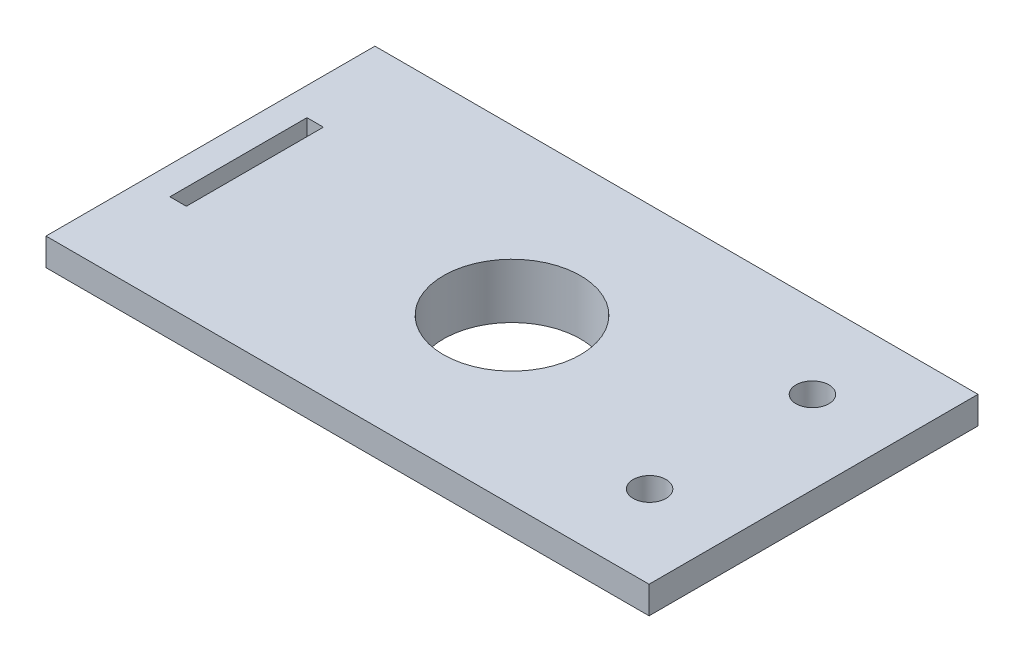
ISO-10303-21;
HEADER;
FILE_DESCRIPTION(('STEP AP214'),'2;1');
FILE_NAME('part.step','',(''),(''),'','','');
FILE_SCHEMA(('AUTOMOTIVE_DESIGN { 1 0 10303 214 1 1 1 1 }'));
ENDSEC;
DATA;
#1=APPLICATION_CONTEXT('core data for automotive mechanical design processes');
#2=APPLICATION_PROTOCOL_DEFINITION('international standard','automotive_design',2000,#1);
#3=PRODUCT_CONTEXT('',#1,'mechanical');
#4=PRODUCT('Part','Part','',(#3));
#5=PRODUCT_RELATED_PRODUCT_CATEGORY('part','',(#4));
#6=PRODUCT_DEFINITION_FORMATION('','',#4);
#7=PRODUCT_DEFINITION_CONTEXT('part definition',#1,'design');
#8=PRODUCT_DEFINITION('design','',#6,#7);
#9=PRODUCT_DEFINITION_SHAPE('','',#8);
#10=(LENGTH_UNIT() NAMED_UNIT(*) SI_UNIT(.MILLI.,.METRE.));
#11=(NAMED_UNIT(*) PLANE_ANGLE_UNIT() SI_UNIT($,.RADIAN.));
#12=(NAMED_UNIT(*) SI_UNIT($,.STERADIAN.) SOLID_ANGLE_UNIT());
#13=UNCERTAINTY_MEASURE_WITH_UNIT(LENGTH_MEASURE(1.E-05),#10,'distance_accuracy_value','');
#14=(GEOMETRIC_REPRESENTATION_CONTEXT(3) GLOBAL_UNCERTAINTY_ASSIGNED_CONTEXT((#13)) GLOBAL_UNIT_ASSIGNED_CONTEXT((#10,
#11,#12)) REPRESENTATION_CONTEXT('',''));
#15=CARTESIAN_POINT('',(0.,0.,0.));
#16=DIRECTION('',(0.,0.,1.));
#17=DIRECTION('',(1.,0.,0.));
#18=AXIS2_PLACEMENT_3D('',#15,#16,#17);
#19=CARTESIAN_POINT('',(-49.9,-5.,-24.9));
#20=DIRECTION('',(1.,0.,0.));
#21=DIRECTION('',(0.,0.,-1.));
#22=AXIS2_PLACEMENT_3D('',#19,#20,#21);
#23=PLANE('',#22);
#24=DIRECTION('',(0.,0.,-1.));
#25=VECTOR('',#24,1.);
#26=CARTESIAN_POINT('',(-49.9,-5.,-24.9));
#27=LINE('',#26,#25);
#28=CARTESIAN_POINT('',(-49.9,-5.,-12.5));
#29=VERTEX_POINT('',#28);
#30=CARTESIAN_POINT('',(-49.9,-5.,-24.9));
#31=VERTEX_POINT('',#30);
#32=EDGE_CURVE('E179',#29,#31,#27,.T.);
#33=ORIENTED_EDGE('',*,*,#32,.F.);
#34=DIRECTION('',(0.,-1.,0.));
#35=VECTOR('',#34,1.);
#36=CARTESIAN_POINT('',(-49.9,5.,-12.5));
#37=LINE('',#36,#35);
#38=CARTESIAN_POINT('',(-49.9,0.,-12.5));
#39=VERTEX_POINT('',#38);
#40=EDGE_CURVE('E165',#39,#29,#37,.T.);
#41=ORIENTED_EDGE('',*,*,#40,.F.);
#42=DIRECTION('',(0.,0.,-1.));
#43=VECTOR('',#42,1.);
#44=CARTESIAN_POINT('',(-49.9,0.,-24.9));
#45=LINE('',#44,#43);
#46=CARTESIAN_POINT('',(-49.9,0.,-24.9));
#47=VERTEX_POINT('',#46);
#48=EDGE_CURVE('E191',#39,#47,#45,.T.);
#49=ORIENTED_EDGE('',*,*,#48,.T.);
#50=DIRECTION('',(0.,1.,0.));
#51=VECTOR('',#50,1.);
#52=CARTESIAN_POINT('',(-49.9,-5.,-24.9));
#53=LINE('',#52,#51);
#54=EDGE_CURVE('E199',#31,#47,#53,.T.);
#55=ORIENTED_EDGE('',*,*,#54,.F.);
#56=EDGE_LOOP('',(#33,#41,#49,#55));
#57=FACE_BOUND('',#56,.T.);
#58=ADVANCED_FACE('F35',(#57),#23,.F.);
#59=CARTESIAN_POINT('',(55.,5.,30.));
#60=DIRECTION('',(-1.,0.,0.));
#61=DIRECTION('',(0.,0.,1.));
#62=AXIS2_PLACEMENT_3D('',#59,#60,#61);
#63=PLANE('',#62);
#64=DIRECTION('',(0.,0.,-1.));
#65=VECTOR('',#64,1.);
#66=CARTESIAN_POINT('',(55.,0.,30.));
#67=LINE('',#66,#65);
#68=CARTESIAN_POINT('',(55.,0.,30.));
#69=VERTEX_POINT('',#68);
#70=CARTESIAN_POINT('',(55.,0.,-30.));
#71=VERTEX_POINT('',#70);
#72=EDGE_CURVE('E208',#69,#71,#67,.T.);
#73=ORIENTED_EDGE('',*,*,#72,.T.);
#74=DIRECTION('',(0.,-1.,0.));
#75=VECTOR('',#74,1.);
#76=CARTESIAN_POINT('',(55.,5.,-30.));
#77=LINE('',#76,#75);
#78=CARTESIAN_POINT('',(55.,5.,-30.));
#79=VERTEX_POINT('',#78);
#80=EDGE_CURVE('E11',#79,#71,#77,.T.);
#81=ORIENTED_EDGE('',*,*,#80,.F.);
#82=DIRECTION('',(0.,0.,-1.));
#83=VECTOR('',#82,1.);
#84=CARTESIAN_POINT('',(55.,5.,30.));
#85=LINE('',#84,#83);
#86=CARTESIAN_POINT('',(55.,5.,30.));
#87=VERTEX_POINT('',#86);
#88=EDGE_CURVE('E209',#87,#79,#85,.T.);
#89=ORIENTED_EDGE('',*,*,#88,.F.);
#90=DIRECTION('',(0.,-1.,0.));
#91=VECTOR('',#90,1.);
#92=CARTESIAN_POINT('',(55.,5.,30.));
#93=LINE('',#92,#91);
#94=EDGE_CURVE('E219',#87,#69,#93,.T.);
#95=ORIENTED_EDGE('',*,*,#94,.T.);
#96=EDGE_LOOP('',(#73,#81,#89,#95));
#97=FACE_BOUND('',#96,.T.);
#98=ADVANCED_FACE('F37',(#97),#63,.F.);
#99=CARTESIAN_POINT('',(-55.,5.,-30.));
#100=DIRECTION('',(0.,0.,1.));
#101=DIRECTION('',(1.,0.,0.));
#102=AXIS2_PLACEMENT_3D('',#99,#100,#101);
#103=PLANE('',#102);
#104=DIRECTION('',(-1.,0.,0.));
#105=VECTOR('',#104,1.);
#106=CARTESIAN_POINT('',(-55.,0.,-30.));
#107=LINE('',#106,#105);
#108=CARTESIAN_POINT('',(-55.,0.,-30.));
#109=VERTEX_POINT('',#108);
#110=EDGE_CURVE('E222',#71,#109,#107,.T.);
#111=ORIENTED_EDGE('',*,*,#110,.T.);
#112=DIRECTION('',(0.,-1.,0.));
#113=VECTOR('',#112,1.);
#114=CARTESIAN_POINT('',(-55.,5.,-30.));
#115=LINE('',#114,#113);
#116=CARTESIAN_POINT('',(-55.,5.,-30.));
#117=VERTEX_POINT('',#116);
#118=EDGE_CURVE('E43',#117,#109,#115,.T.);
#119=ORIENTED_EDGE('',*,*,#118,.F.);
#120=DIRECTION('',(-1.,0.,0.));
#121=VECTOR('',#120,1.);
#122=CARTESIAN_POINT('',(-55.,5.,-30.));
#123=LINE('',#122,#121);
#124=EDGE_CURVE('E212',#79,#117,#123,.T.);
#125=ORIENTED_EDGE('',*,*,#124,.F.);
#126=ORIENTED_EDGE('',*,*,#80,.T.);
#127=EDGE_LOOP('',(#111,#119,#125,#126));
#128=FACE_BOUND('',#127,.T.);
#129=ADVANCED_FACE('F250',(#128),#103,.F.);
#130=CARTESIAN_POINT('',(-55.,5.,30.));
#131=DIRECTION('',(1.,0.,0.));
#132=DIRECTION('',(0.,0.,-1.));
#133=AXIS2_PLACEMENT_3D('',#130,#131,#132);
#134=PLANE('',#133);
#135=DIRECTION('',(0.,0.,1.));
#136=VECTOR('',#135,1.);
#137=CARTESIAN_POINT('',(-55.,0.,30.));
#138=LINE('',#137,#136);
#139=CARTESIAN_POINT('',(-55.,0.,30.));
#140=VERTEX_POINT('',#139);
#141=EDGE_CURVE('E224',#109,#140,#138,.T.);
#142=ORIENTED_EDGE('',*,*,#141,.T.);
#143=DIRECTION('',(0.,-1.,0.));
#144=VECTOR('',#143,1.);
#145=CARTESIAN_POINT('',(-55.,5.,30.));
#146=LINE('',#145,#144);
#147=CARTESIAN_POINT('',(-55.,5.,30.));
#148=VERTEX_POINT('',#147);
#149=EDGE_CURVE('E229',#148,#140,#146,.T.);
#150=ORIENTED_EDGE('',*,*,#149,.F.);
#151=DIRECTION('',(0.,0.,1.));
#152=VECTOR('',#151,1.);
#153=CARTESIAN_POINT('',(-55.,5.,30.));
#154=LINE('',#153,#152);
#155=EDGE_CURVE('E215',#117,#148,#154,.T.);
#156=ORIENTED_EDGE('',*,*,#155,.F.);
#157=ORIENTED_EDGE('',*,*,#118,.T.);
#158=EDGE_LOOP('',(#142,#150,#156,#157));
#159=FACE_BOUND('',#158,.T.);
#160=ADVANCED_FACE('F236',(#159),#134,.F.);
#161=CARTESIAN_POINT('',(-55.,5.,30.));
#162=DIRECTION('',(0.,0.,-1.));
#163=DIRECTION('',(-1.,0.,0.));
#164=AXIS2_PLACEMENT_3D('',#161,#162,#163);
#165=PLANE('',#164);
#166=DIRECTION('',(1.,0.,0.));
#167=VECTOR('',#166,1.);
#168=CARTESIAN_POINT('',(-55.,0.,30.));
#169=LINE('',#168,#167);
#170=EDGE_CURVE('E213',#140,#69,#169,.T.);
#171=ORIENTED_EDGE('',*,*,#170,.T.);
#172=ORIENTED_EDGE('',*,*,#94,.F.);
#173=DIRECTION('',(1.,0.,0.));
#174=VECTOR('',#173,1.);
#175=CARTESIAN_POINT('',(-55.,5.,30.));
#176=LINE('',#175,#174);
#177=EDGE_CURVE('E217',#148,#87,#176,.T.);
#178=ORIENTED_EDGE('',*,*,#177,.F.);
#179=ORIENTED_EDGE('',*,*,#149,.T.);
#180=EDGE_LOOP('',(#171,#172,#178,#179));
#181=FACE_BOUND('',#180,.T.);
#182=ADVANCED_FACE('F245',(#181),#165,.F.);
#183=CARTESIAN_POINT('',(0.,5.,0.));
#184=DIRECTION('',(0.,-1.,0.));
#185=DIRECTION('',(0.,0.,-1.));
#186=AXIS2_PLACEMENT_3D('',#183,#184,#185);
#187=PLANE('',#186);
#188=CARTESIAN_POINT('',(0.,5.,0.));
#189=DIRECTION('',(0.,1.,0.));
#190=DIRECTION('',(0.,0.,1.));
#191=AXIS2_PLACEMENT_3D('',#188,#189,#190);
#192=CIRCLE('',#191,12.5);
#193=CARTESIAN_POINT('',(0.,5.,12.5));
#194=VERTEX_POINT('',#193);
#195=EDGE_CURVE('E328',#194,#194,#192,.T.);
#196=ORIENTED_EDGE('',*,*,#195,.F.);
#197=EDGE_LOOP('',(#196));
#198=FACE_BOUND('',#197,.T.);
#199=CARTESIAN_POINT('',(39.9,5.,-14.9));
#200=DIRECTION('',(0.,-1.,0.));
#201=DIRECTION('',(0.,0.,-1.));
#202=AXIS2_PLACEMENT_3D('',#199,#200,#201);
#203=CIRCLE('',#202,3.);
#204=CARTESIAN_POINT('',(39.9,5.,-17.9));
#205=VERTEX_POINT('',#204);
#206=EDGE_CURVE('E160',#205,#205,#203,.T.);
#207=ORIENTED_EDGE('',*,*,#206,.T.);
#208=EDGE_LOOP('',(#207));
#209=FACE_BOUND('',#208,.T.);
#210=CARTESIAN_POINT('',(40.,5.,14.9));
#211=DIRECTION('',(0.,-1.,0.));
#212=DIRECTION('',(0.,0.,-1.));
#213=AXIS2_PLACEMENT_3D('',#210,#211,#212);
#214=CIRCLE('',#213,3.);
#215=CARTESIAN_POINT('',(40.,5.,11.9));
#216=VERTEX_POINT('',#215);
#217=EDGE_CURVE('E326',#216,#216,#214,.T.);
#218=ORIENTED_EDGE('',*,*,#217,.T.);
#219=EDGE_LOOP('',(#218));
#220=FACE_BOUND('',#219,.T.);
#221=DIRECTION('',(0.,0.,-1.));
#222=VECTOR('',#221,1.);
#223=CARTESIAN_POINT('',(-49.9,5.,-12.5));
#224=LINE('',#223,#222);
#225=CARTESIAN_POINT('',(-49.9,5.,12.5));
#226=VERTEX_POINT('',#225);
#227=CARTESIAN_POINT('',(-49.9,5.,-12.5));
#228=VERTEX_POINT('',#227);
#229=EDGE_CURVE('E139',#226,#228,#224,.T.);
#230=ORIENTED_EDGE('',*,*,#229,.T.);
#231=DIRECTION('',(1.,0.,0.));
#232=VECTOR('',#231,1.);
#233=CARTESIAN_POINT('',(-49.9,5.,-12.5));
#234=LINE('',#233,#232);
#235=CARTESIAN_POINT('',(-46.9,5.,-12.5));
#236=VERTEX_POINT('',#235);
#237=EDGE_CURVE('E133',#228,#236,#234,.T.);
#238=ORIENTED_EDGE('',*,*,#237,.T.);
#239=DIRECTION('',(0.,0.,1.));
#240=VECTOR('',#239,1.);
#241=CARTESIAN_POINT('',(-46.9,5.,-12.5));
#242=LINE('',#241,#240);
#243=CARTESIAN_POINT('',(-46.9,5.,12.5));
#244=VERTEX_POINT('',#243);
#245=EDGE_CURVE('E142',#236,#244,#242,.T.);
#246=ORIENTED_EDGE('',*,*,#245,.T.);
#247=DIRECTION('',(-1.,0.,0.));
#248=VECTOR('',#247,1.);
#249=CARTESIAN_POINT('',(-46.9,5.,12.5));
#250=LINE('',#249,#248);
#251=EDGE_CURVE('E50',#244,#226,#250,.T.);
#252=ORIENTED_EDGE('',*,*,#251,.T.);
#253=EDGE_LOOP('',(#230,#238,#246,#252));
#254=FACE_BOUND('',#253,.T.);
#255=ORIENTED_EDGE('',*,*,#88,.T.);
#256=ORIENTED_EDGE('',*,*,#124,.T.);
#257=ORIENTED_EDGE('',*,*,#155,.T.);
#258=ORIENTED_EDGE('',*,*,#177,.T.);
#259=EDGE_LOOP('',(#255,#256,#257,#258));
#260=FACE_BOUND('',#259,.T.);
#261=ADVANCED_FACE('F146',(#198,#209,#220,#254,#260),#187,.F.);
#262=CARTESIAN_POINT('',(0.,0.,0.));
#263=DIRECTION('',(0.,-1.,0.));
#264=DIRECTION('',(0.,0.,-1.));
#265=AXIS2_PLACEMENT_3D('',#262,#263,#264);
#266=PLANE('',#265);
#267=DIRECTION('',(0.,0.,1.));
#268=VECTOR('',#267,1.);
#269=CARTESIAN_POINT('',(49.9,0.,-24.9));
#270=LINE('',#269,#268);
#271=CARTESIAN_POINT('',(49.9,0.,-24.9));
#272=VERTEX_POINT('',#271);
#273=CARTESIAN_POINT('',(49.9,0.,24.9));
#274=VERTEX_POINT('',#273);
#275=EDGE_CURVE('E172',#272,#274,#270,.T.);
#276=ORIENTED_EDGE('',*,*,#275,.F.);
#277=DIRECTION('',(1.,0.,0.));
#278=VECTOR('',#277,1.);
#279=CARTESIAN_POINT('',(-49.9,0.,-24.9));
#280=LINE('',#279,#278);
#281=EDGE_CURVE('E177',#47,#272,#280,.T.);
#282=ORIENTED_EDGE('',*,*,#281,.F.);
#283=ORIENTED_EDGE('',*,*,#48,.F.);
#284=DIRECTION('',(0.,0.,-1.));
#285=VECTOR('',#284,1.);
#286=CARTESIAN_POINT('',(-49.9,0.,0.));
#287=LINE('',#286,#285);
#288=CARTESIAN_POINT('',(-49.9,0.,12.5));
#289=VERTEX_POINT('',#288);
#290=EDGE_CURVE('E164',#289,#39,#287,.T.);
#291=ORIENTED_EDGE('',*,*,#290,.F.);
#292=CARTESIAN_POINT('',(-49.9,0.,24.9));
#293=VERTEX_POINT('',#292);
#294=EDGE_CURVE('E192',#293,#289,#45,.T.);
#295=ORIENTED_EDGE('',*,*,#294,.F.);
#296=DIRECTION('',(-1.,0.,0.));
#297=VECTOR('',#296,1.);
#298=CARTESIAN_POINT('',(-49.9,0.,24.9));
#299=LINE('',#298,#297);
#300=EDGE_CURVE('E188',#274,#293,#299,.T.);
#301=ORIENTED_EDGE('',*,*,#300,.F.);
#302=EDGE_LOOP('',(#276,#282,#283,#291,#295,#301));
#303=FACE_BOUND('',#302,.T.);
#304=ORIENTED_EDGE('',*,*,#72,.F.);
#305=ORIENTED_EDGE('',*,*,#170,.F.);
#306=ORIENTED_EDGE('',*,*,#141,.F.);
#307=ORIENTED_EDGE('',*,*,#110,.F.);
#308=EDGE_LOOP('',(#304,#305,#306,#307));
#309=FACE_BOUND('',#308,.T.);
#310=ADVANCED_FACE('F242',(#303,#309),#266,.T.);
#311=CARTESIAN_POINT('',(49.9,-5.,-24.9));
#312=DIRECTION('',(-1.,0.,0.));
#313=DIRECTION('',(0.,0.,1.));
#314=AXIS2_PLACEMENT_3D('',#311,#312,#313);
#315=PLANE('',#314);
#316=ORIENTED_EDGE('',*,*,#275,.T.);
#317=DIRECTION('',(0.,1.,0.));
#318=VECTOR('',#317,1.);
#319=CARTESIAN_POINT('',(49.9,-5.,24.9));
#320=LINE('',#319,#318);
#321=CARTESIAN_POINT('',(49.9,-5.,24.9));
#322=VERTEX_POINT('',#321);
#323=EDGE_CURVE('E205',#322,#274,#320,.T.);
#324=ORIENTED_EDGE('',*,*,#323,.F.);
#325=DIRECTION('',(0.,0.,1.));
#326=VECTOR('',#325,1.);
#327=CARTESIAN_POINT('',(49.9,-5.,-24.9));
#328=LINE('',#327,#326);
#329=CARTESIAN_POINT('',(49.9,-5.,-24.9));
#330=VERTEX_POINT('',#329);
#331=EDGE_CURVE('E173',#330,#322,#328,.T.);
#332=ORIENTED_EDGE('',*,*,#331,.F.);
#333=DIRECTION('',(0.,1.,0.));
#334=VECTOR('',#333,1.);
#335=CARTESIAN_POINT('',(49.9,-5.,-24.9));
#336=LINE('',#335,#334);
#337=EDGE_CURVE('E185',#330,#272,#336,.T.);
#338=ORIENTED_EDGE('',*,*,#337,.T.);
#339=EDGE_LOOP('',(#316,#324,#332,#338));
#340=FACE_BOUND('',#339,.T.);
#341=ADVANCED_FACE('F276',(#340),#315,.F.);
#342=CARTESIAN_POINT('',(-49.9,-5.,24.9));
#343=DIRECTION('',(0.,0.,-1.));
#344=DIRECTION('',(-1.,0.,0.));
#345=AXIS2_PLACEMENT_3D('',#342,#343,#344);
#346=PLANE('',#345);
#347=ORIENTED_EDGE('',*,*,#300,.T.);
#348=DIRECTION('',(0.,1.,0.));
#349=VECTOR('',#348,1.);
#350=CARTESIAN_POINT('',(-49.9,-5.,24.9));
#351=LINE('',#350,#349);
#352=CARTESIAN_POINT('',(-49.9,-5.,24.9));
#353=VERTEX_POINT('',#352);
#354=EDGE_CURVE('E202',#353,#293,#351,.T.);
#355=ORIENTED_EDGE('',*,*,#354,.F.);
#356=DIRECTION('',(-1.,0.,0.));
#357=VECTOR('',#356,1.);
#358=CARTESIAN_POINT('',(-49.9,-5.,24.9));
#359=LINE('',#358,#357);
#360=EDGE_CURVE('E176',#322,#353,#359,.T.);
#361=ORIENTED_EDGE('',*,*,#360,.F.);
#362=ORIENTED_EDGE('',*,*,#323,.T.);
#363=EDGE_LOOP('',(#347,#355,#361,#362));
#364=FACE_BOUND('',#363,.T.);
#365=ADVANCED_FACE('F268',(#364),#346,.F.);
#366=ORIENTED_EDGE('',*,*,#294,.T.);
#367=DIRECTION('',(0.,-1.,0.));
#368=VECTOR('',#367,1.);
#369=CARTESIAN_POINT('',(-49.9,5.,12.5));
#370=LINE('',#369,#368);
#371=CARTESIAN_POINT('',(-49.9,-5.,12.5));
#372=VERTEX_POINT('',#371);
#373=EDGE_CURVE('E169',#289,#372,#370,.T.);
#374=ORIENTED_EDGE('',*,*,#373,.T.);
#375=EDGE_CURVE('E180',#353,#372,#27,.T.);
#376=ORIENTED_EDGE('',*,*,#375,.F.);
#377=ORIENTED_EDGE('',*,*,#354,.T.);
#378=EDGE_LOOP('',(#366,#374,#376,#377));
#379=FACE_BOUND('',#378,.T.);
#380=ADVANCED_FACE('F260',(#379),#23,.F.);
#381=CARTESIAN_POINT('',(-49.9,-5.,-24.9));
#382=DIRECTION('',(0.,0.,1.));
#383=DIRECTION('',(1.,0.,0.));
#384=AXIS2_PLACEMENT_3D('',#381,#382,#383);
#385=PLANE('',#384);
#386=ORIENTED_EDGE('',*,*,#281,.T.);
#387=ORIENTED_EDGE('',*,*,#337,.F.);
#388=DIRECTION('',(1.,0.,0.));
#389=VECTOR('',#388,1.);
#390=CARTESIAN_POINT('',(-49.9,-5.,-24.9));
#391=LINE('',#390,#389);
#392=EDGE_CURVE('E183',#31,#330,#391,.T.);
#393=ORIENTED_EDGE('',*,*,#392,.F.);
#394=ORIENTED_EDGE('',*,*,#54,.T.);
#395=EDGE_LOOP('',(#386,#387,#393,#394));
#396=FACE_BOUND('',#395,.T.);
#397=ADVANCED_FACE('F267',(#396),#385,.F.);
#398=CARTESIAN_POINT('',(0.,-5.,0.));
#399=DIRECTION('',(0.,1.,0.));
#400=DIRECTION('',(0.,0.,1.));
#401=AXIS2_PLACEMENT_3D('',#398,#399,#400);
#402=PLANE('',#401);
#403=CARTESIAN_POINT('',(0.,-5.,0.));
#404=DIRECTION('',(0.,1.,0.));
#405=DIRECTION('',(0.,0.,1.));
#406=AXIS2_PLACEMENT_3D('',#403,#404,#405);
#407=CIRCLE('',#406,12.5);
#408=CARTESIAN_POINT('',(0.,-5.,12.5));
#409=VERTEX_POINT('',#408);
#410=EDGE_CURVE('E318',#409,#409,#407,.T.);
#411=ORIENTED_EDGE('',*,*,#410,.T.);
#412=EDGE_LOOP('',(#411));
#413=FACE_BOUND('',#412,.T.);
#414=CARTESIAN_POINT('',(39.9,-5.,-14.9));
#415=DIRECTION('',(0.,-1.,0.));
#416=DIRECTION('',(0.,0.,-1.));
#417=AXIS2_PLACEMENT_3D('',#414,#415,#416);
#418=CIRCLE('',#417,3.);
#419=CARTESIAN_POINT('',(39.9,-5.,-17.9));
#420=VERTEX_POINT('',#419);
#421=EDGE_CURVE('E322',#420,#420,#418,.T.);
#422=ORIENTED_EDGE('',*,*,#421,.F.);
#423=EDGE_LOOP('',(#422));
#424=FACE_BOUND('',#423,.T.);
#425=CARTESIAN_POINT('',(40.,-5.,14.9));
#426=DIRECTION('',(0.,-1.,0.));
#427=DIRECTION('',(0.,0.,-1.));
#428=AXIS2_PLACEMENT_3D('',#425,#426,#427);
#429=CIRCLE('',#428,3.);
#430=CARTESIAN_POINT('',(40.,-5.,11.9));
#431=VERTEX_POINT('',#430);
#432=EDGE_CURVE('E154',#431,#431,#429,.T.);
#433=ORIENTED_EDGE('',*,*,#432,.F.);
#434=EDGE_LOOP('',(#433));
#435=FACE_BOUND('',#434,.T.);
#436=DIRECTION('',(0.,0.,1.));
#437=VECTOR('',#436,1.);
#438=CARTESIAN_POINT('',(-46.9,-5.,-12.5));
#439=LINE('',#438,#437);
#440=CARTESIAN_POINT('',(-46.9,-5.,-12.5));
#441=VERTEX_POINT('',#440);
#442=CARTESIAN_POINT('',(-46.9,-5.,12.5));
#443=VERTEX_POINT('',#442);
#444=EDGE_CURVE('E151',#441,#443,#439,.T.);
#445=ORIENTED_EDGE('',*,*,#444,.F.);
#446=DIRECTION('',(1.,0.,0.));
#447=VECTOR('',#446,1.);
#448=CARTESIAN_POINT('',(-49.9,-5.,-12.5));
#449=LINE('',#448,#447);
#450=EDGE_CURVE('E58',#29,#441,#449,.T.);
#451=ORIENTED_EDGE('',*,*,#450,.F.);
#452=ORIENTED_EDGE('',*,*,#32,.T.);
#453=ORIENTED_EDGE('',*,*,#392,.T.);
#454=ORIENTED_EDGE('',*,*,#331,.T.);
#455=ORIENTED_EDGE('',*,*,#360,.T.);
#456=ORIENTED_EDGE('',*,*,#375,.T.);
#457=DIRECTION('',(-1.,0.,0.));
#458=VECTOR('',#457,1.);
#459=CARTESIAN_POINT('',(-46.9,-5.,12.5));
#460=LINE('',#459,#458);
#461=EDGE_CURVE('E149',#443,#372,#460,.T.);
#462=ORIENTED_EDGE('',*,*,#461,.F.);
#463=EDGE_LOOP('',(#445,#451,#452,#453,#454,#455,#456,#462));
#464=FACE_BOUND('',#463,.T.);
#465=ADVANCED_FACE('F274',(#413,#424,#435,#464),#402,.F.);
#466=CARTESIAN_POINT('',(-49.9,5.,-12.5));
#467=DIRECTION('',(0.,0.,-1.));
#468=DIRECTION('',(-1.,0.,0.));
#469=AXIS2_PLACEMENT_3D('',#466,#467,#468);
#470=PLANE('',#469);
#471=ORIENTED_EDGE('',*,*,#450,.T.);
#472=DIRECTION('',(0.,-1.,0.));
#473=VECTOR('',#472,1.);
#474=CARTESIAN_POINT('',(-46.9,5.,-12.5));
#475=LINE('',#474,#473);
#476=EDGE_CURVE('E128',#236,#441,#475,.T.);
#477=ORIENTED_EDGE('',*,*,#476,.F.);
#478=ORIENTED_EDGE('',*,*,#237,.F.);
#479=EDGE_CURVE('E162',#228,#39,#37,.T.);
#480=ORIENTED_EDGE('',*,*,#479,.T.);
#481=ORIENTED_EDGE('',*,*,#40,.T.);
#482=EDGE_LOOP('',(#471,#477,#478,#480,#481));
#483=FACE_BOUND('',#482,.T.);
#484=ADVANCED_FACE('F130',(#483),#470,.F.);
#485=CARTESIAN_POINT('',(-49.9,5.,-12.5));
#486=DIRECTION('',(-1.,0.,0.));
#487=DIRECTION('',(0.,0.,1.));
#488=AXIS2_PLACEMENT_3D('',#485,#486,#487);
#489=PLANE('',#488);
#490=ORIENTED_EDGE('',*,*,#290,.T.);
#491=ORIENTED_EDGE('',*,*,#479,.F.);
#492=ORIENTED_EDGE('',*,*,#229,.F.);
#493=EDGE_CURVE('E166',#226,#289,#370,.T.);
#494=ORIENTED_EDGE('',*,*,#493,.T.);
#495=EDGE_LOOP('',(#490,#491,#492,#494));
#496=FACE_BOUND('',#495,.T.);
#497=ADVANCED_FACE('F296',(#496),#489,.F.);
#498=CARTESIAN_POINT('',(-46.9,5.,12.5));
#499=DIRECTION('',(0.,0.,1.));
#500=DIRECTION('',(1.,0.,0.));
#501=AXIS2_PLACEMENT_3D('',#498,#499,#500);
#502=PLANE('',#501);
#503=ORIENTED_EDGE('',*,*,#461,.T.);
#504=ORIENTED_EDGE('',*,*,#373,.F.);
#505=ORIENTED_EDGE('',*,*,#493,.F.);
#506=ORIENTED_EDGE('',*,*,#251,.F.);
#507=DIRECTION('',(0.,-1.,0.));
#508=VECTOR('',#507,1.);
#509=CARTESIAN_POINT('',(-46.9,5.,12.5));
#510=LINE('',#509,#508);
#511=EDGE_CURVE('E138',#244,#443,#510,.T.);
#512=ORIENTED_EDGE('',*,*,#511,.T.);
#513=EDGE_LOOP('',(#503,#504,#505,#506,#512));
#514=FACE_BOUND('',#513,.T.);
#515=ADVANCED_FACE('F294',(#514),#502,.F.);
#516=CARTESIAN_POINT('',(-46.9,5.,-12.5));
#517=DIRECTION('',(1.,0.,0.));
#518=DIRECTION('',(0.,0.,-1.));
#519=AXIS2_PLACEMENT_3D('',#516,#517,#518);
#520=PLANE('',#519);
#521=ORIENTED_EDGE('',*,*,#444,.T.);
#522=ORIENTED_EDGE('',*,*,#511,.F.);
#523=ORIENTED_EDGE('',*,*,#245,.F.);
#524=ORIENTED_EDGE('',*,*,#476,.T.);
#525=EDGE_LOOP('',(#521,#522,#523,#524));
#526=FACE_BOUND('',#525,.T.);
#527=ADVANCED_FACE('F143',(#526),#520,.F.);
#528=CARTESIAN_POINT('',(40.,5.,14.9));
#529=DIRECTION('',(0.,-1.,0.));
#530=DIRECTION('',(0.,0.,-1.));
#531=AXIS2_PLACEMENT_3D('',#528,#529,#530);
#532=CYLINDRICAL_SURFACE('',#531,3.);
#533=ORIENTED_EDGE('',*,*,#217,.F.);
#534=EDGE_LOOP('',(#533));
#535=FACE_BOUND('',#534,.T.);
#536=ORIENTED_EDGE('',*,*,#432,.T.);
#537=EDGE_LOOP('',(#536));
#538=FACE_BOUND('',#537,.T.);
#539=ADVANCED_FACE('F306',(#535,#538),#532,.F.);
#540=CARTESIAN_POINT('',(39.9,5.,-14.9));
#541=DIRECTION('',(0.,-1.,0.));
#542=DIRECTION('',(0.,0.,-1.));
#543=AXIS2_PLACEMENT_3D('',#540,#541,#542);
#544=CYLINDRICAL_SURFACE('',#543,3.);
#545=ORIENTED_EDGE('',*,*,#206,.F.);
#546=EDGE_LOOP('',(#545));
#547=FACE_BOUND('',#546,.T.);
#548=ORIENTED_EDGE('',*,*,#421,.T.);
#549=EDGE_LOOP('',(#548));
#550=FACE_BOUND('',#549,.T.);
#551=ADVANCED_FACE('F336',(#547,#550),#544,.F.);
#552=CARTESIAN_POINT('',(0.,-5.,0.));
#553=DIRECTION('',(0.,1.,0.));
#554=DIRECTION('',(0.,0.,1.));
#555=AXIS2_PLACEMENT_3D('',#552,#553,#554);
#556=CYLINDRICAL_SURFACE('',#555,12.5);
#557=ORIENTED_EDGE('',*,*,#410,.F.);
#558=EDGE_LOOP('',(#557));
#559=FACE_BOUND('',#558,.T.);
#560=ORIENTED_EDGE('',*,*,#195,.T.);
#561=EDGE_LOOP('',(#560));
#562=FACE_BOUND('',#561,.T.);
#563=ADVANCED_FACE('F338',(#559,#562),#556,.F.);
#564=CLOSED_SHELL('',(#58,#98,#129,#160,#182,#261,#310,#341,#365,#380,#397,#465,#484,#497,#515,
#527,#539,#551,#563));
#565=MANIFOLD_SOLID_BREP('B2',#564);
#566=ADVANCED_BREP_SHAPE_REPRESENTATION('',(#18,#565),#14);
#567=SHAPE_DEFINITION_REPRESENTATION(#9,#566);
ENDSEC;
END-ISO-10303-21;
